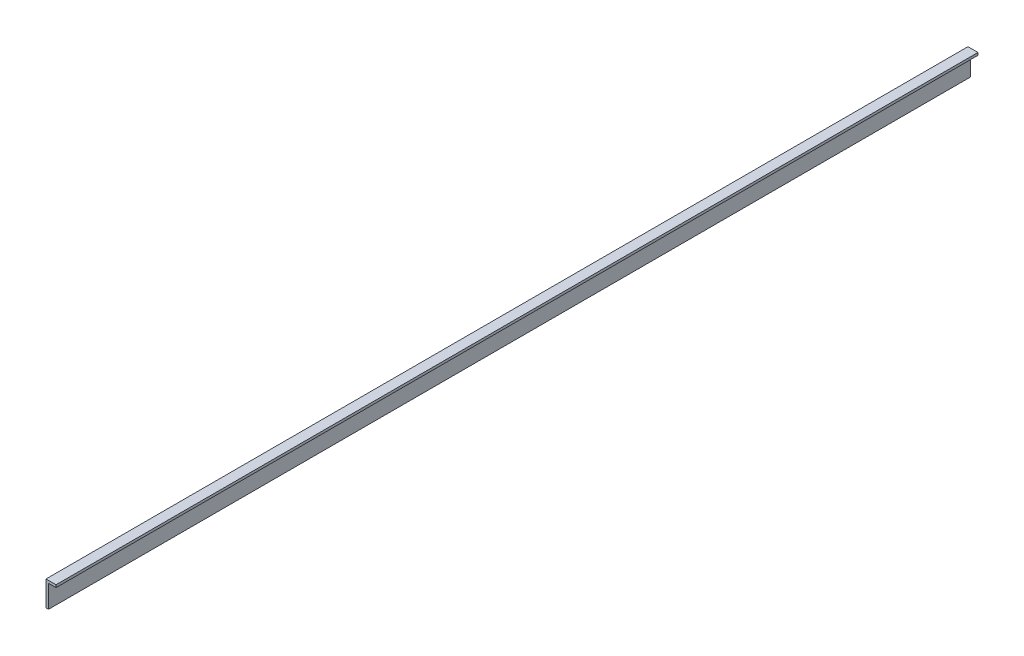
ISO-10303-21;
HEADER;
FILE_DESCRIPTION(('STEP AP214'),'2;1');
FILE_NAME('part.step','',(''),(''),'','','');
FILE_SCHEMA(('AUTOMOTIVE_DESIGN { 1 0 10303 214 1 1 1 1 }'));
ENDSEC;
DATA;
#1=APPLICATION_CONTEXT('core data for automotive mechanical design processes');
#2=APPLICATION_PROTOCOL_DEFINITION('international standard','automotive_design',2000,#1);
#3=PRODUCT_CONTEXT('',#1,'mechanical');
#4=PRODUCT('Part','Part','',(#3));
#5=PRODUCT_RELATED_PRODUCT_CATEGORY('part','',(#4));
#6=PRODUCT_DEFINITION_FORMATION('','',#4);
#7=PRODUCT_DEFINITION_CONTEXT('part definition',#1,'design');
#8=PRODUCT_DEFINITION('design','',#6,#7);
#9=PRODUCT_DEFINITION_SHAPE('','',#8);
#10=(LENGTH_UNIT() NAMED_UNIT(*) SI_UNIT(.MILLI.,.METRE.));
#11=(NAMED_UNIT(*) PLANE_ANGLE_UNIT() SI_UNIT($,.RADIAN.));
#12=(NAMED_UNIT(*) SI_UNIT($,.STERADIAN.) SOLID_ANGLE_UNIT());
#13=UNCERTAINTY_MEASURE_WITH_UNIT(LENGTH_MEASURE(1.E-05),#10,'distance_accuracy_value','');
#14=(GEOMETRIC_REPRESENTATION_CONTEXT(3) GLOBAL_UNCERTAINTY_ASSIGNED_CONTEXT((#13)) GLOBAL_UNIT_ASSIGNED_CONTEXT((#10,
#11,#12)) REPRESENTATION_CONTEXT('',''));
#15=CARTESIAN_POINT('',(0.,0.,0.));
#16=DIRECTION('',(0.,0.,1.));
#17=DIRECTION('',(1.,0.,0.));
#18=AXIS2_PLACEMENT_3D('',#15,#16,#17);
#19=CARTESIAN_POINT('',(393.5,422.5,-755.5));
#20=DIRECTION('',(1.,0.,0.));
#21=DIRECTION('',(0.,0.,-1.));
#22=AXIS2_PLACEMENT_3D('',#19,#20,#21);
#23=PLANE('',#22);
#24=DIRECTION('',(0.,1.,0.));
#25=VECTOR('',#24,1.);
#26=CARTESIAN_POINT('',(393.5,422.5,-20.));
#27=LINE('',#26,#25);
#28=CARTESIAN_POINT('',(393.5,404.5,-20.));
#29=VERTEX_POINT('',#28);
#30=CARTESIAN_POINT('',(393.5,422.5,-20.));
#31=VERTEX_POINT('',#30);
#32=EDGE_CURVE('E124',#29,#31,#27,.T.);
#33=ORIENTED_EDGE('',*,*,#32,.F.);
#34=DIRECTION('',(0.,0.,1.));
#35=VECTOR('',#34,1.);
#36=CARTESIAN_POINT('',(393.5,404.5,-755.5));
#37=LINE('',#36,#35);
#38=CARTESIAN_POINT('',(393.5,404.5,-755.5));
#39=VERTEX_POINT('',#38);
#40=EDGE_CURVE('E11',#39,#29,#37,.T.);
#41=ORIENTED_EDGE('',*,*,#40,.F.);
#42=DIRECTION('',(0.,1.,0.));
#43=VECTOR('',#42,1.);
#44=CARTESIAN_POINT('',(393.5,422.5,-755.5));
#45=LINE('',#44,#43);
#46=CARTESIAN_POINT('',(393.5,422.5,-755.5));
#47=VERTEX_POINT('',#46);
#48=EDGE_CURVE('E138',#39,#47,#45,.T.);
#49=ORIENTED_EDGE('',*,*,#48,.T.);
#50=DIRECTION('',(0.,0.,1.));
#51=VECTOR('',#50,1.);
#52=CARTESIAN_POINT('',(393.5,422.5,-755.5));
#53=LINE('',#52,#51);
#54=EDGE_CURVE('E42',#47,#31,#53,.T.);
#55=ORIENTED_EDGE('',*,*,#54,.T.);
#56=EDGE_LOOP('',(#33,#41,#49,#55));
#57=FACE_BOUND('',#56,.T.);
#58=ADVANCED_FACE('F39',(#57),#23,.T.);
#59=CARTESIAN_POINT('',(393.5,404.5,-755.5));
#60=DIRECTION('',(0.,-1.,0.));
#61=DIRECTION('',(0.,0.,-1.));
#62=AXIS2_PLACEMENT_3D('',#59,#60,#61);
#63=PLANE('',#62);
#64=DIRECTION('',(1.,0.,0.));
#65=VECTOR('',#64,1.);
#66=CARTESIAN_POINT('',(393.5,404.5,-20.));
#67=LINE('',#66,#65);
#68=CARTESIAN_POINT('',(391.5,404.5,-20.));
#69=VERTEX_POINT('',#68);
#70=EDGE_CURVE('E136',#69,#29,#67,.T.);
#71=ORIENTED_EDGE('',*,*,#70,.F.);
#72=DIRECTION('',(0.,0.,1.));
#73=VECTOR('',#72,1.);
#74=CARTESIAN_POINT('',(391.5,404.5,-755.5));
#75=LINE('',#74,#73);
#76=CARTESIAN_POINT('',(391.5,404.5,-755.5));
#77=VERTEX_POINT('',#76);
#78=EDGE_CURVE('E48',#77,#69,#75,.T.);
#79=ORIENTED_EDGE('',*,*,#78,.F.);
#80=DIRECTION('',(1.,0.,0.));
#81=VECTOR('',#80,1.);
#82=CARTESIAN_POINT('',(393.5,404.5,-755.5));
#83=LINE('',#82,#81);
#84=EDGE_CURVE('E114',#77,#39,#83,.T.);
#85=ORIENTED_EDGE('',*,*,#84,.T.);
#86=ORIENTED_EDGE('',*,*,#40,.T.);
#87=EDGE_LOOP('',(#71,#79,#85,#86));
#88=FACE_BOUND('',#87,.T.);
#89=ADVANCED_FACE('F146',(#88),#63,.T.);
#90=CARTESIAN_POINT('',(391.5,404.5,-755.5));
#91=DIRECTION('',(-1.,0.,0.));
#92=DIRECTION('',(0.,0.,1.));
#93=AXIS2_PLACEMENT_3D('',#90,#91,#92);
#94=PLANE('',#93);
#95=DIRECTION('',(0.,-1.,0.));
#96=VECTOR('',#95,1.);
#97=CARTESIAN_POINT('',(391.5,404.5,-20.));
#98=LINE('',#97,#96);
#99=CARTESIAN_POINT('',(391.5,424.5,-20.));
#100=VERTEX_POINT('',#99);
#101=EDGE_CURVE('E101',#100,#69,#98,.T.);
#102=ORIENTED_EDGE('',*,*,#101,.F.);
#103=DIRECTION('',(0.,0.,1.));
#104=VECTOR('',#103,1.);
#105=CARTESIAN_POINT('',(391.5,424.5,-755.5));
#106=LINE('',#105,#104);
#107=CARTESIAN_POINT('',(391.5,424.5,-755.5));
#108=VERTEX_POINT('',#107);
#109=EDGE_CURVE('E96',#108,#100,#106,.T.);
#110=ORIENTED_EDGE('',*,*,#109,.F.);
#111=DIRECTION('',(0.,-1.,0.));
#112=VECTOR('',#111,1.);
#113=CARTESIAN_POINT('',(391.5,404.5,-755.5));
#114=LINE('',#113,#112);
#115=EDGE_CURVE('E99',#108,#77,#114,.T.);
#116=ORIENTED_EDGE('',*,*,#115,.T.);
#117=ORIENTED_EDGE('',*,*,#78,.T.);
#118=EDGE_LOOP('',(#102,#110,#116,#117));
#119=FACE_BOUND('',#118,.T.);
#120=ADVANCED_FACE('F98',(#119),#94,.T.);
#121=CARTESIAN_POINT('',(391.5,424.5,-755.5));
#122=DIRECTION('',(0.,1.,0.));
#123=DIRECTION('',(0.,0.,1.));
#124=AXIS2_PLACEMENT_3D('',#121,#122,#123);
#125=PLANE('',#124);
#126=DIRECTION('',(-1.,0.,0.));
#127=VECTOR('',#126,1.);
#128=CARTESIAN_POINT('',(391.5,424.5,-20.));
#129=LINE('',#128,#127);
#130=CARTESIAN_POINT('',(399.5,424.5,-20.));
#131=VERTEX_POINT('',#130);
#132=EDGE_CURVE('E133',#131,#100,#129,.T.);
#133=ORIENTED_EDGE('',*,*,#132,.F.);
#134=DIRECTION('',(0.,0.,1.));
#135=VECTOR('',#134,1.);
#136=CARTESIAN_POINT('',(399.5,424.5,-755.5));
#137=LINE('',#136,#135);
#138=CARTESIAN_POINT('',(399.5,424.5,-755.5));
#139=VERTEX_POINT('',#138);
#140=EDGE_CURVE('E106',#139,#131,#137,.T.);
#141=ORIENTED_EDGE('',*,*,#140,.F.);
#142=DIRECTION('',(-1.,0.,0.));
#143=VECTOR('',#142,1.);
#144=CARTESIAN_POINT('',(391.5,424.5,-755.5));
#145=LINE('',#144,#143);
#146=EDGE_CURVE('E112',#139,#108,#145,.T.);
#147=ORIENTED_EDGE('',*,*,#146,.T.);
#148=ORIENTED_EDGE('',*,*,#109,.T.);
#149=EDGE_LOOP('',(#133,#141,#147,#148));
#150=FACE_BOUND('',#149,.T.);
#151=ADVANCED_FACE('F116',(#150),#125,.T.);
#152=CARTESIAN_POINT('',(399.5,424.5,-755.5));
#153=DIRECTION('',(1.,0.,0.));
#154=DIRECTION('',(0.,0.,-1.));
#155=AXIS2_PLACEMENT_3D('',#152,#153,#154);
#156=PLANE('',#155);
#157=DIRECTION('',(0.,1.,0.));
#158=VECTOR('',#157,1.);
#159=CARTESIAN_POINT('',(399.5,424.5,-20.));
#160=LINE('',#159,#158);
#161=CARTESIAN_POINT('',(399.5,422.5,-20.));
#162=VERTEX_POINT('',#161);
#163=EDGE_CURVE('E130',#162,#131,#160,.T.);
#164=ORIENTED_EDGE('',*,*,#163,.F.);
#165=DIRECTION('',(0.,0.,1.));
#166=VECTOR('',#165,1.);
#167=CARTESIAN_POINT('',(399.5,422.5,-755.5));
#168=LINE('',#167,#166);
#169=CARTESIAN_POINT('',(399.5,422.5,-755.5));
#170=VERTEX_POINT('',#169);
#171=EDGE_CURVE('E141',#170,#162,#168,.T.);
#172=ORIENTED_EDGE('',*,*,#171,.F.);
#173=DIRECTION('',(0.,1.,0.));
#174=VECTOR('',#173,1.);
#175=CARTESIAN_POINT('',(399.5,424.5,-755.5));
#176=LINE('',#175,#174);
#177=EDGE_CURVE('E117',#170,#139,#176,.T.);
#178=ORIENTED_EDGE('',*,*,#177,.T.);
#179=ORIENTED_EDGE('',*,*,#140,.T.);
#180=EDGE_LOOP('',(#164,#172,#178,#179));
#181=FACE_BOUND('',#180,.T.);
#182=ADVANCED_FACE('F159',(#181),#156,.T.);
#183=CARTESIAN_POINT('',(399.5,422.5,-755.5));
#184=DIRECTION('',(0.,-1.,0.));
#185=DIRECTION('',(0.,0.,-1.));
#186=AXIS2_PLACEMENT_3D('',#183,#184,#185);
#187=PLANE('',#186);
#188=DIRECTION('',(1.,0.,0.));
#189=VECTOR('',#188,1.);
#190=CARTESIAN_POINT('',(399.5,422.5,-20.));
#191=LINE('',#190,#189);
#192=EDGE_CURVE('E127',#31,#162,#191,.T.);
#193=ORIENTED_EDGE('',*,*,#192,.F.);
#194=ORIENTED_EDGE('',*,*,#54,.F.);
#195=DIRECTION('',(1.,0.,0.));
#196=VECTOR('',#195,1.);
#197=CARTESIAN_POINT('',(399.5,422.5,-755.5));
#198=LINE('',#197,#196);
#199=EDGE_CURVE('E119',#47,#170,#198,.T.);
#200=ORIENTED_EDGE('',*,*,#199,.T.);
#201=ORIENTED_EDGE('',*,*,#171,.T.);
#202=EDGE_LOOP('',(#193,#194,#200,#201));
#203=FACE_BOUND('',#202,.T.);
#204=ADVANCED_FACE('F143',(#203),#187,.T.);
#205=CARTESIAN_POINT('',(0.,0.,-755.5));
#206=DIRECTION('',(0.,0.,-1.));
#207=DIRECTION('',(-1.,0.,0.));
#208=AXIS2_PLACEMENT_3D('',#205,#206,#207);
#209=PLANE('',#208);
#210=ORIENTED_EDGE('',*,*,#48,.F.);
#211=ORIENTED_EDGE('',*,*,#84,.F.);
#212=ORIENTED_EDGE('',*,*,#115,.F.);
#213=ORIENTED_EDGE('',*,*,#146,.F.);
#214=ORIENTED_EDGE('',*,*,#177,.F.);
#215=ORIENTED_EDGE('',*,*,#199,.F.);
#216=EDGE_LOOP('',(#210,#211,#212,#213,#214,#215));
#217=FACE_BOUND('',#216,.T.);
#218=ADVANCED_FACE('F110',(#217),#209,.T.);
#219=CARTESIAN_POINT('',(0.,0.,-20.));
#220=DIRECTION('',(0.,0.,-1.));
#221=DIRECTION('',(-1.,0.,0.));
#222=AXIS2_PLACEMENT_3D('',#219,#220,#221);
#223=PLANE('',#222);
#224=ORIENTED_EDGE('',*,*,#32,.T.);
#225=ORIENTED_EDGE('',*,*,#192,.T.);
#226=ORIENTED_EDGE('',*,*,#163,.T.);
#227=ORIENTED_EDGE('',*,*,#132,.T.);
#228=ORIENTED_EDGE('',*,*,#101,.T.);
#229=ORIENTED_EDGE('',*,*,#70,.T.);
#230=EDGE_LOOP('',(#224,#225,#226,#227,#228,#229));
#231=FACE_BOUND('',#230,.T.);
#232=ADVANCED_FACE('F145',(#231),#223,.F.);
#233=CLOSED_SHELL('',(#58,#89,#120,#151,#182,#204,#218,#232));
#234=MANIFOLD_SOLID_BREP('B2',#233);
#235=ADVANCED_BREP_SHAPE_REPRESENTATION('',(#18,#234),#14);
#236=SHAPE_DEFINITION_REPRESENTATION(#9,#235);
ENDSEC;
END-ISO-10303-21;
